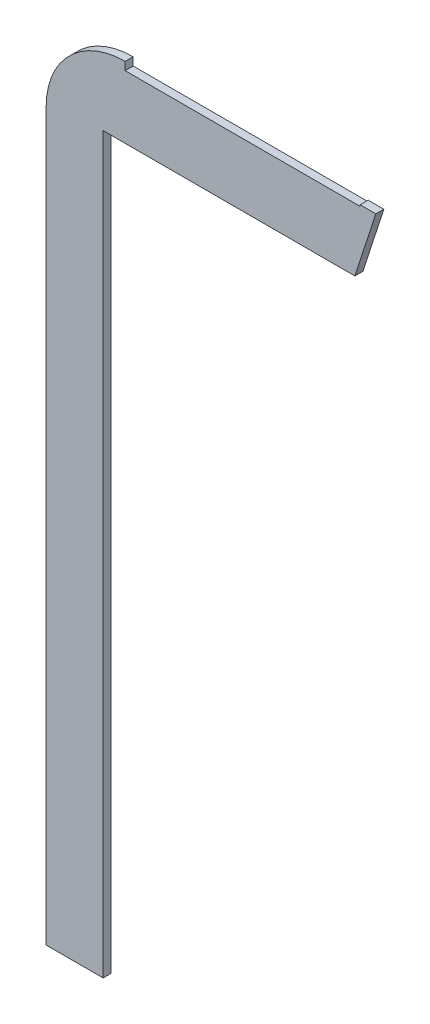
ISO-10303-21;
HEADER;
FILE_DESCRIPTION(('STEP AP214'),'2;1');
FILE_NAME('part.step','',(''),(''),'','','');
FILE_SCHEMA(('AUTOMOTIVE_DESIGN { 1 0 10303 214 1 1 1 1 }'));
ENDSEC;
DATA;
#1=APPLICATION_CONTEXT('core data for automotive mechanical design processes');
#2=APPLICATION_PROTOCOL_DEFINITION('international standard','automotive_design',2000,#1);
#3=PRODUCT_CONTEXT('',#1,'mechanical');
#4=PRODUCT('Part','Part','',(#3));
#5=PRODUCT_RELATED_PRODUCT_CATEGORY('part','',(#4));
#6=PRODUCT_DEFINITION_FORMATION('','',#4);
#7=PRODUCT_DEFINITION_CONTEXT('part definition',#1,'design');
#8=PRODUCT_DEFINITION('design','',#6,#7);
#9=PRODUCT_DEFINITION_SHAPE('','',#8);
#10=(LENGTH_UNIT() NAMED_UNIT(*) SI_UNIT(.MILLI.,.METRE.));
#11=(NAMED_UNIT(*) PLANE_ANGLE_UNIT() SI_UNIT($,.RADIAN.));
#12=(NAMED_UNIT(*) SI_UNIT($,.STERADIAN.) SOLID_ANGLE_UNIT());
#13=UNCERTAINTY_MEASURE_WITH_UNIT(LENGTH_MEASURE(1.E-05),#10,'distance_accuracy_value','');
#14=(GEOMETRIC_REPRESENTATION_CONTEXT(3) GLOBAL_UNCERTAINTY_ASSIGNED_CONTEXT((#13)) GLOBAL_UNIT_ASSIGNED_CONTEXT((#10,
#11,#12)) REPRESENTATION_CONTEXT('',''));
#15=CARTESIAN_POINT('',(0.,0.,0.));
#16=DIRECTION('',(0.,0.,1.));
#17=DIRECTION('',(1.,0.,0.));
#18=AXIS2_PLACEMENT_3D('',#15,#16,#17);
#19=CARTESIAN_POINT('',(0.,293.,3.));
#20=DIRECTION('',(0.,1.,0.));
#21=DIRECTION('',(0.,0.,1.));
#22=AXIS2_PLACEMENT_3D('',#19,#20,#21);
#23=PLANE('',#22);
#24=DIRECTION('',(0.,0.,1.));
#25=VECTOR('',#24,1.);
#26=CARTESIAN_POINT('',(95.9380792356703,293.,0.));
#27=LINE('',#26,#25);
#28=CARTESIAN_POINT('',(95.9380792356703,293.,0.));
#29=VERTEX_POINT('',#28);
#30=CARTESIAN_POINT('',(95.9380792356704,293.,3.));
#31=VERTEX_POINT('',#30);
#32=EDGE_CURVE('E172',#29,#31,#27,.T.);
#33=ORIENTED_EDGE('',*,*,#32,.T.);
#34=DIRECTION('',(1.,0.,0.));
#35=VECTOR('',#34,1.);
#36=CARTESIAN_POINT('',(0.,293.,3.));
#37=LINE('',#36,#35);
#38=CARTESIAN_POINT('',(101.804347826087,293.,3.));
#39=VERTEX_POINT('',#38);
#40=EDGE_CURVE('E51',#31,#39,#37,.T.);
#41=ORIENTED_EDGE('',*,*,#40,.T.);
#42=DIRECTION('',(0.,0.,-1.));
#43=VECTOR('',#42,1.);
#44=CARTESIAN_POINT('',(101.804347826087,293.,3.));
#45=LINE('',#44,#43);
#46=CARTESIAN_POINT('',(101.804347826087,293.,0.));
#47=VERTEX_POINT('',#46);
#48=EDGE_CURVE('E126',#39,#47,#45,.T.);
#49=ORIENTED_EDGE('',*,*,#48,.T.);
#50=DIRECTION('',(1.,0.,0.));
#51=VECTOR('',#50,1.);
#52=CARTESIAN_POINT('',(0.,293.,0.));
#53=LINE('',#52,#51);
#54=EDGE_CURVE('E83',#29,#47,#53,.T.);
#55=ORIENTED_EDGE('',*,*,#54,.F.);
#56=EDGE_LOOP('',(#33,#41,#49,#55));
#57=FACE_BOUND('',#56,.T.);
#58=ADVANCED_FACE('F35',(#57),#23,.T.);
#59=CARTESIAN_POINT('',(8.20034245621373,266.,3.));
#60=DIRECTION('',(0.,0.,-1.));
#61=DIRECTION('',(-1.,0.,0.));
#62=AXIS2_PLACEMENT_3D('',#59,#60,#61);
#63=CYLINDRICAL_SURFACE('',#62,29.5003424562162);
#64=DIRECTION('',(0.,0.,-1.));
#65=VECTOR('',#64,1.);
#66=CARTESIAN_POINT('',(-21.3000000000024,265.999999999996,3.));
#67=LINE('',#66,#65);
#68=CARTESIAN_POINT('',(-21.3000000000024,265.999999999996,3.));
#69=VERTEX_POINT('',#68);
#70=CARTESIAN_POINT('',(-21.3000000000024,265.999999999996,0.));
#71=VERTEX_POINT('',#70);
#72=EDGE_CURVE('E11',#69,#71,#67,.T.);
#73=ORIENTED_EDGE('',*,*,#72,.F.);
#74=CARTESIAN_POINT('',(8.20034245621373,266.,3.));
#75=DIRECTION('',(0.,0.,1.));
#76=DIRECTION('',(1.,0.,0.));
#77=AXIS2_PLACEMENT_3D('',#74,#75,#76);
#78=CIRCLE('',#77,29.5003424562162);
#79=CARTESIAN_POINT('',(8.20034245621373,295.5003424453,3.));
#80=VERTEX_POINT('',#79);
#81=EDGE_CURVE('E91',#80,#69,#78,.T.);
#82=ORIENTED_EDGE('',*,*,#81,.F.);
#83=DIRECTION('',(0.,0.,-1.));
#84=VECTOR('',#83,1.);
#85=CARTESIAN_POINT('',(8.20034245621373,295.500342450758,3.));
#86=LINE('',#85,#84);
#87=CARTESIAN_POINT('',(8.20034245621373,295.5003424453,0.));
#88=VERTEX_POINT('',#87);
#89=EDGE_CURVE('E132',#80,#88,#86,.T.);
#90=ORIENTED_EDGE('',*,*,#89,.T.);
#91=CARTESIAN_POINT('',(8.20034245621373,266.,0.));
#92=DIRECTION('',(0.,0.,1.));
#93=DIRECTION('',(1.,0.,0.));
#94=AXIS2_PLACEMENT_3D('',#91,#92,#93);
#95=CIRCLE('',#94,29.5003424562162);
#96=EDGE_CURVE('E131',#88,#71,#95,.T.);
#97=ORIENTED_EDGE('',*,*,#96,.T.);
#98=EDGE_LOOP('',(#73,#82,#90,#97));
#99=FACE_BOUND('',#98,.T.);
#100=ADVANCED_FACE('F217',(#99),#63,.T.);
#101=CARTESIAN_POINT('',(-21.3000000000005,-1.5243418458608E-13,3.));
#102=DIRECTION('',(-1.,0.,0.));
#103=DIRECTION('',(0.,-1.,0.));
#104=AXIS2_PLACEMENT_3D('',#101,#102,#103);
#105=PLANE('',#104);
#106=DIRECTION('',(0.,1.,0.));
#107=VECTOR('',#106,1.);
#108=CARTESIAN_POINT('',(-21.3000000000005,-1.5243418458608E-13,0.));
#109=LINE('',#108,#107);
#110=CARTESIAN_POINT('',(-21.3000000000005,-5.,0.));
#111=VERTEX_POINT('',#110);
#112=EDGE_CURVE('E134',#111,#71,#109,.T.);
#113=ORIENTED_EDGE('',*,*,#112,.F.);
#114=DIRECTION('',(0.,0.,-1.));
#115=VECTOR('',#114,1.);
#116=CARTESIAN_POINT('',(-21.3000000000005,-5.,3.));
#117=LINE('',#116,#115);
#118=CARTESIAN_POINT('',(-21.3000000000005,-5.,3.));
#119=VERTEX_POINT('',#118);
#120=EDGE_CURVE('E43',#119,#111,#117,.T.);
#121=ORIENTED_EDGE('',*,*,#120,.F.);
#122=DIRECTION('',(0.,1.,0.));
#123=VECTOR('',#122,1.);
#124=CARTESIAN_POINT('',(-21.3000000000005,-1.5243418458608E-13,3.));
#125=LINE('',#124,#123);
#126=EDGE_CURVE('E166',#119,#69,#125,.T.);
#127=ORIENTED_EDGE('',*,*,#126,.T.);
#128=ORIENTED_EDGE('',*,*,#72,.T.);
#129=EDGE_LOOP('',(#113,#121,#127,#128));
#130=FACE_BOUND('',#129,.T.);
#131=ADVANCED_FACE('F153',(#130),#105,.T.);
#132=CARTESIAN_POINT('',(0.,-4.99999999999999,3.));
#133=DIRECTION('',(0.,-1.,0.));
#134=DIRECTION('',(1.,0.,0.));
#135=AXIS2_PLACEMENT_3D('',#132,#133,#134);
#136=PLANE('',#135);
#137=DIRECTION('',(-1.,0.,0.));
#138=VECTOR('',#137,1.);
#139=CARTESIAN_POINT('',(0.,-4.99999999999999,0.));
#140=LINE('',#139,#138);
#141=CARTESIAN_POINT('',(0.,-4.99999999999999,0.));
#142=VERTEX_POINT('',#141);
#143=EDGE_CURVE('E137',#142,#111,#140,.T.);
#144=ORIENTED_EDGE('',*,*,#143,.F.);
#145=DIRECTION('',(0.,0.,-1.));
#146=VECTOR('',#145,1.);
#147=CARTESIAN_POINT('',(0.,-4.99999999999999,3.));
#148=LINE('',#147,#146);
#149=CARTESIAN_POINT('',(0.,-4.99999999999999,3.));
#150=VERTEX_POINT('',#149);
#151=EDGE_CURVE('E113',#150,#142,#148,.T.);
#152=ORIENTED_EDGE('',*,*,#151,.F.);
#153=DIRECTION('',(-1.,0.,0.));
#154=VECTOR('',#153,1.);
#155=CARTESIAN_POINT('',(0.,-4.99999999999999,3.));
#156=LINE('',#155,#154);
#157=EDGE_CURVE('E121',#150,#119,#156,.T.);
#158=ORIENTED_EDGE('',*,*,#157,.T.);
#159=ORIENTED_EDGE('',*,*,#120,.T.);
#160=EDGE_LOOP('',(#144,#152,#158,#159));
#161=FACE_BOUND('',#160,.T.);
#162=ADVANCED_FACE('F150',(#161),#136,.T.);
#163=CARTESIAN_POINT('',(0.,0.,3.));
#164=DIRECTION('',(1.,0.,0.));
#165=DIRECTION('',(0.,1.,0.));
#166=AXIS2_PLACEMENT_3D('',#163,#164,#165);
#167=PLANE('',#166);
#168=DIRECTION('',(0.,-1.,0.));
#169=VECTOR('',#168,1.);
#170=CARTESIAN_POINT('',(0.,0.,0.));
#171=LINE('',#170,#169);
#172=CARTESIAN_POINT('',(0.,269.,0.));
#173=VERTEX_POINT('',#172);
#174=EDGE_CURVE('E109',#173,#142,#171,.T.);
#175=ORIENTED_EDGE('',*,*,#174,.F.);
#176=DIRECTION('',(0.,0.,-1.));
#177=VECTOR('',#176,1.);
#178=CARTESIAN_POINT('',(0.,269.,3.));
#179=LINE('',#178,#177);
#180=CARTESIAN_POINT('',(0.,269.,3.));
#181=VERTEX_POINT('',#180);
#182=EDGE_CURVE('E104',#181,#173,#179,.T.);
#183=ORIENTED_EDGE('',*,*,#182,.F.);
#184=DIRECTION('',(0.,-1.,0.));
#185=VECTOR('',#184,1.);
#186=CARTESIAN_POINT('',(0.,0.,3.));
#187=LINE('',#186,#185);
#188=EDGE_CURVE('E107',#181,#150,#187,.T.);
#189=ORIENTED_EDGE('',*,*,#188,.T.);
#190=ORIENTED_EDGE('',*,*,#151,.T.);
#191=EDGE_LOOP('',(#175,#183,#189,#190));
#192=FACE_BOUND('',#191,.T.);
#193=ADVANCED_FACE('F106',(#192),#167,.T.);
#194=CARTESIAN_POINT('',(0.,269.,3.));
#195=DIRECTION('',(0.,-1.,0.));
#196=DIRECTION('',(0.,0.,-1.));
#197=AXIS2_PLACEMENT_3D('',#194,#195,#196);
#198=PLANE('',#197);
#199=DIRECTION('',(-1.,0.,0.));
#200=VECTOR('',#199,1.);
#201=CARTESIAN_POINT('',(0.,269.,0.));
#202=LINE('',#201,#200);
#203=CARTESIAN_POINT('',(93.9782608695653,269.,0.));
#204=VERTEX_POINT('',#203);
#205=EDGE_CURVE('E141',#204,#173,#202,.T.);
#206=ORIENTED_EDGE('',*,*,#205,.F.);
#207=DIRECTION('',(0.,0.,-1.));
#208=VECTOR('',#207,1.);
#209=CARTESIAN_POINT('',(93.9782608695653,269.,3.));
#210=LINE('',#209,#208);
#211=CARTESIAN_POINT('',(93.9782608695653,269.,3.));
#212=VERTEX_POINT('',#211);
#213=EDGE_CURVE('E75',#212,#204,#210,.T.);
#214=ORIENTED_EDGE('',*,*,#213,.F.);
#215=DIRECTION('',(-1.,0.,0.));
#216=VECTOR('',#215,1.);
#217=CARTESIAN_POINT('',(0.,269.,3.));
#218=LINE('',#217,#216);
#219=EDGE_CURVE('E119',#212,#181,#218,.T.);
#220=ORIENTED_EDGE('',*,*,#219,.T.);
#221=ORIENTED_EDGE('',*,*,#182,.T.);
#222=EDGE_LOOP('',(#206,#214,#220,#221));
#223=FACE_BOUND('',#222,.T.);
#224=ADVANCED_FACE('F123',(#223),#198,.T.);
#225=CARTESIAN_POINT('',(5.65912003417427,-1.84536522853507,3.));
#226=DIRECTION('',(0.95072983948148,-0.310020599830914,0.));
#227=DIRECTION('',(0.310020599830914,0.95072983948148,0.));
#228=AXIS2_PLACEMENT_3D('',#225,#226,#227);
#229=PLANE('',#228);
#230=DIRECTION('',(-0.310020599830914,-0.95072983948148,0.));
#231=VECTOR('',#230,1.);
#232=CARTESIAN_POINT('',(5.65912003417427,-1.84536522853507,0.));
#233=LINE('',#232,#231);
#234=EDGE_CURVE('E143',#47,#204,#233,.T.);
#235=ORIENTED_EDGE('',*,*,#234,.F.);
#236=ORIENTED_EDGE('',*,*,#48,.F.);
#237=DIRECTION('',(-0.310020599830914,-0.95072983948148,0.));
#238=VECTOR('',#237,1.);
#239=CARTESIAN_POINT('',(5.65912003417427,-1.84536522853507,3.));
#240=LINE('',#239,#238);
#241=EDGE_CURVE('E124',#39,#212,#240,.T.);
#242=ORIENTED_EDGE('',*,*,#241,.T.);
#243=ORIENTED_EDGE('',*,*,#213,.T.);
#244=EDGE_LOOP('',(#235,#236,#242,#243));
#245=FACE_BOUND('',#244,.T.);
#246=ADVANCED_FACE('F156',(#245),#229,.T.);
#247=CARTESIAN_POINT('',(0.,0.,3.));
#248=DIRECTION('',(0.,0.,1.));
#249=DIRECTION('',(1.,0.,0.));
#250=AXIS2_PLACEMENT_3D('',#247,#248,#249);
#251=PLANE('',#250);
#252=DIRECTION('',(0.,-1.,0.));
#253=VECTOR('',#252,1.);
#254=CARTESIAN_POINT('',(8.20034245621373,0.,3.));
#255=LINE('',#254,#253);
#256=CARTESIAN_POINT('',(8.20034245621373,292.5,3.));
#257=VERTEX_POINT('',#256);
#258=EDGE_CURVE('E177',#80,#257,#255,.T.);
#259=ORIENTED_EDGE('',*,*,#258,.F.);
#260=ORIENTED_EDGE('',*,*,#81,.T.);
#261=ORIENTED_EDGE('',*,*,#126,.F.);
#262=ORIENTED_EDGE('',*,*,#157,.F.);
#263=ORIENTED_EDGE('',*,*,#188,.F.);
#264=ORIENTED_EDGE('',*,*,#219,.F.);
#265=ORIENTED_EDGE('',*,*,#241,.F.);
#266=ORIENTED_EDGE('',*,*,#40,.F.);
#267=DIRECTION('',(0.,1.,0.));
#268=VECTOR('',#267,1.);
#269=CARTESIAN_POINT('',(95.938079235669,-4.43752115165208E-13,3.));
#270=LINE('',#269,#268);
#271=CARTESIAN_POINT('',(95.9380792356703,292.5,3.));
#272=VERTEX_POINT('',#271);
#273=EDGE_CURVE('E162',#272,#31,#270,.T.);
#274=ORIENTED_EDGE('',*,*,#273,.F.);
#275=DIRECTION('',(1.,0.,0.));
#276=VECTOR('',#275,1.);
#277=CARTESIAN_POINT('',(0.,292.5,3.));
#278=LINE('',#277,#276);
#279=EDGE_CURVE('E174',#257,#272,#278,.T.);
#280=ORIENTED_EDGE('',*,*,#279,.F.);
#281=EDGE_LOOP('',(#259,#260,#261,#262,#263,#264,#265,#266,#274,#280));
#282=FACE_BOUND('',#281,.T.);
#283=ADVANCED_FACE('F117',(#282),#251,.T.);
#284=CARTESIAN_POINT('',(0.,0.,0.));
#285=DIRECTION('',(0.,0.,1.));
#286=DIRECTION('',(1.,0.,0.));
#287=AXIS2_PLACEMENT_3D('',#284,#285,#286);
#288=PLANE('',#287);
#289=ORIENTED_EDGE('',*,*,#96,.F.);
#290=DIRECTION('',(0.,1.,0.));
#291=VECTOR('',#290,1.);
#292=CARTESIAN_POINT('',(8.20034245621373,295.5003424453,0.));
#293=LINE('',#292,#291);
#294=CARTESIAN_POINT('',(8.20034245621373,292.5,0.));
#295=VERTEX_POINT('',#294);
#296=EDGE_CURVE('E185',#295,#88,#293,.T.);
#297=ORIENTED_EDGE('',*,*,#296,.F.);
#298=DIRECTION('',(-1.,0.,0.));
#299=VECTOR('',#298,1.);
#300=CARTESIAN_POINT('',(8.20034245621373,292.5,0.));
#301=LINE('',#300,#299);
#302=CARTESIAN_POINT('',(95.9380792356703,292.5,0.));
#303=VERTEX_POINT('',#302);
#304=EDGE_CURVE('E190',#303,#295,#301,.T.);
#305=ORIENTED_EDGE('',*,*,#304,.F.);
#306=DIRECTION('',(0.,-1.,0.));
#307=VECTOR('',#306,1.);
#308=CARTESIAN_POINT('',(95.9380792356704,295.5003424453,0.));
#309=LINE('',#308,#307);
#310=EDGE_CURVE('E193',#29,#303,#309,.T.);
#311=ORIENTED_EDGE('',*,*,#310,.F.);
#312=ORIENTED_EDGE('',*,*,#54,.T.);
#313=ORIENTED_EDGE('',*,*,#234,.T.);
#314=ORIENTED_EDGE('',*,*,#205,.T.);
#315=ORIENTED_EDGE('',*,*,#174,.T.);
#316=ORIENTED_EDGE('',*,*,#143,.T.);
#317=ORIENTED_EDGE('',*,*,#112,.T.);
#318=EDGE_LOOP('',(#289,#297,#305,#311,#312,#313,#314,#315,#316,#317));
#319=FACE_BOUND('',#318,.T.);
#320=ADVANCED_FACE('F155',(#319),#288,.F.);
#321=CARTESIAN_POINT('',(8.20034245621373,295.5003424453,300.));
#322=DIRECTION('',(-1.,0.,0.));
#323=DIRECTION('',(0.,0.,1.));
#324=AXIS2_PLACEMENT_3D('',#321,#322,#323);
#325=PLANE('',#324);
#326=ORIENTED_EDGE('',*,*,#258,.T.);
#327=DIRECTION('',(0.,0.,-1.));
#328=VECTOR('',#327,1.);
#329=CARTESIAN_POINT('',(8.20034245621373,292.5,300.));
#330=LINE('',#329,#328);
#331=EDGE_CURVE('E181',#257,#295,#330,.T.);
#332=ORIENTED_EDGE('',*,*,#331,.T.);
#333=ORIENTED_EDGE('',*,*,#296,.T.);
#334=ORIENTED_EDGE('',*,*,#89,.F.);
#335=EDGE_LOOP('',(#326,#332,#333,#334));
#336=FACE_BOUND('',#335,.T.);
#337=ADVANCED_FACE('F215',(#336),#325,.F.);
#338=CARTESIAN_POINT('',(8.20034245621373,292.5,300.));
#339=DIRECTION('',(0.,-1.,0.));
#340=DIRECTION('',(0.,0.,-1.));
#341=AXIS2_PLACEMENT_3D('',#338,#339,#340);
#342=PLANE('',#341);
#343=ORIENTED_EDGE('',*,*,#279,.T.);
#344=DIRECTION('',(0.,0.,-1.));
#345=VECTOR('',#344,1.);
#346=CARTESIAN_POINT('',(95.9380792356703,292.5,300.));
#347=LINE('',#346,#345);
#348=EDGE_CURVE('E182',#272,#303,#347,.T.);
#349=ORIENTED_EDGE('',*,*,#348,.T.);
#350=ORIENTED_EDGE('',*,*,#304,.T.);
#351=ORIENTED_EDGE('',*,*,#331,.F.);
#352=EDGE_LOOP('',(#343,#349,#350,#351));
#353=FACE_BOUND('',#352,.T.);
#354=ADVANCED_FACE('F207',(#353),#342,.F.);
#355=CARTESIAN_POINT('',(95.9380792356704,295.5003424453,300.));
#356=DIRECTION('',(1.,0.,0.));
#357=DIRECTION('',(0.,1.,0.));
#358=AXIS2_PLACEMENT_3D('',#355,#356,#357);
#359=PLANE('',#358);
#360=ORIENTED_EDGE('',*,*,#32,.F.);
#361=ORIENTED_EDGE('',*,*,#310,.T.);
#362=ORIENTED_EDGE('',*,*,#348,.F.);
#363=ORIENTED_EDGE('',*,*,#273,.T.);
#364=EDGE_LOOP('',(#360,#361,#362,#363));
#365=FACE_BOUND('',#364,.T.);
#366=ADVANCED_FACE('F200',(#365),#359,.F.);
#367=CLOSED_SHELL('',(#58,#100,#131,#162,#193,#224,#246,#283,#320,#337,#354,#366));
#368=MANIFOLD_SOLID_BREP('B2',#367);
#369=ADVANCED_BREP_SHAPE_REPRESENTATION('',(#18,#368),#14);
#370=SHAPE_DEFINITION_REPRESENTATION(#9,#369);
ENDSEC;
END-ISO-10303-21;
